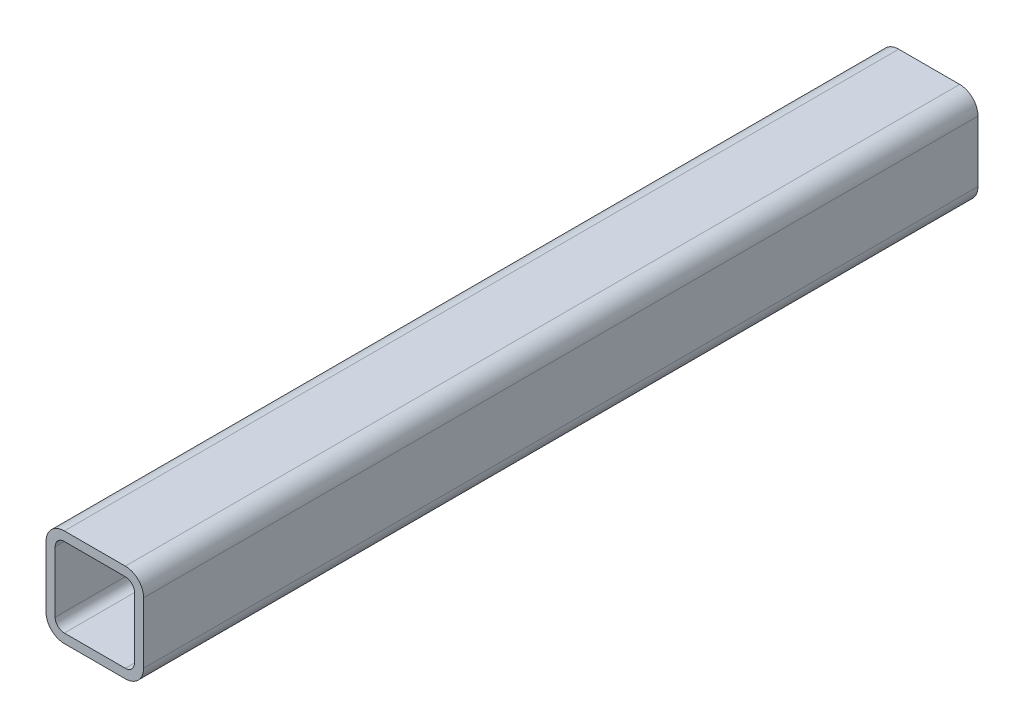
ISO-10303-21;
HEADER;
FILE_DESCRIPTION(('STEP AP214'),'2;1');
FILE_NAME('part.step','',(''),(''),'','','');
FILE_SCHEMA(('AUTOMOTIVE_DESIGN { 1 0 10303 214 1 1 1 1 }'));
ENDSEC;
DATA;
#1=APPLICATION_CONTEXT('core data for automotive mechanical design processes');
#2=APPLICATION_PROTOCOL_DEFINITION('international standard','automotive_design',2000,#1);
#3=PRODUCT_CONTEXT('',#1,'mechanical');
#4=PRODUCT('Part','Part','',(#3));
#5=PRODUCT_RELATED_PRODUCT_CATEGORY('part','',(#4));
#6=PRODUCT_DEFINITION_FORMATION('','',#4);
#7=PRODUCT_DEFINITION_CONTEXT('part definition',#1,'design');
#8=PRODUCT_DEFINITION('design','',#6,#7);
#9=PRODUCT_DEFINITION_SHAPE('','',#8);
#10=(LENGTH_UNIT() NAMED_UNIT(*) SI_UNIT(.MILLI.,.METRE.));
#11=(NAMED_UNIT(*) PLANE_ANGLE_UNIT() SI_UNIT($,.RADIAN.));
#12=(NAMED_UNIT(*) SI_UNIT($,.STERADIAN.) SOLID_ANGLE_UNIT());
#13=UNCERTAINTY_MEASURE_WITH_UNIT(LENGTH_MEASURE(1.E-05),#10,'distance_accuracy_value','');
#14=(GEOMETRIC_REPRESENTATION_CONTEXT(3) GLOBAL_UNCERTAINTY_ASSIGNED_CONTEXT((#13)) GLOBAL_UNIT_ASSIGNED_CONTEXT((#10,
#11,#12)) REPRESENTATION_CONTEXT('',''));
#15=CARTESIAN_POINT('',(0.,0.,0.));
#16=DIRECTION('',(0.,0.,1.));
#17=DIRECTION('',(1.,0.,0.));
#18=AXIS2_PLACEMENT_3D('',#15,#16,#17);
#19=CARTESIAN_POINT('',(41.27,41.27,434.2));
#20=DIRECTION('',(0.,0.,-1.));
#21=DIRECTION('',(-1.,0.,0.));
#22=AXIS2_PLACEMENT_3D('',#19,#20,#21);
#23=PLANE('',#22);
#24=CARTESIAN_POINT('',(41.27,41.27,434.2));
#25=DIRECTION('',(0.,0.,1.));
#26=DIRECTION('',(-1.,0.,0.));
#27=AXIS2_PLACEMENT_3D('',#24,#25,#26);
#28=CIRCLE('',#27,9.53);
#29=CARTESIAN_POINT('',(50.8,41.2699999999999,434.2));
#30=VERTEX_POINT('',#29);
#31=CARTESIAN_POINT('',(41.2699999999999,50.8,434.2));
#32=VERTEX_POINT('',#31);
#33=EDGE_CURVE('E246',#30,#32,#28,.T.);
#34=ORIENTED_EDGE('',*,*,#33,.T.);
#35=DIRECTION('',(-1.,0.,0.));
#36=VECTOR('',#35,1.);
#37=CARTESIAN_POINT('',(9.53000000000007,50.8,434.2));
#38=LINE('',#37,#36);
#39=CARTESIAN_POINT('',(9.53000000000007,50.8,434.2));
#40=VERTEX_POINT('',#39);
#41=EDGE_CURVE('E250',#32,#40,#38,.T.);
#42=ORIENTED_EDGE('',*,*,#41,.T.);
#43=CARTESIAN_POINT('',(9.53,41.27,434.2));
#44=DIRECTION('',(0.,0.,1.));
#45=DIRECTION('',(-1.,0.,0.));
#46=AXIS2_PLACEMENT_3D('',#43,#44,#45);
#47=CIRCLE('',#46,9.53);
#48=CARTESIAN_POINT('',(0.,41.2699999999999,434.2));
#49=VERTEX_POINT('',#48);
#50=EDGE_CURVE('E254',#40,#49,#47,.T.);
#51=ORIENTED_EDGE('',*,*,#50,.T.);
#52=DIRECTION('',(0.,-1.,0.));
#53=VECTOR('',#52,1.);
#54=CARTESIAN_POINT('',(0.,9.53000000000007,434.2));
#55=LINE('',#54,#53);
#56=CARTESIAN_POINT('',(0.,9.53000000000007,434.2));
#57=VERTEX_POINT('',#56);
#58=EDGE_CURVE('E257',#49,#57,#55,.T.);
#59=ORIENTED_EDGE('',*,*,#58,.T.);
#60=CARTESIAN_POINT('',(9.53,9.53,434.2));
#61=DIRECTION('',(0.,0.,1.));
#62=DIRECTION('',(-1.,0.,0.));
#63=AXIS2_PLACEMENT_3D('',#60,#61,#62);
#64=CIRCLE('',#63,9.53);
#65=CARTESIAN_POINT('',(9.53000000000007,0.,434.2));
#66=VERTEX_POINT('',#65);
#67=EDGE_CURVE('E260',#57,#66,#64,.T.);
#68=ORIENTED_EDGE('',*,*,#67,.T.);
#69=DIRECTION('',(1.,0.,0.));
#70=VECTOR('',#69,1.);
#71=CARTESIAN_POINT('',(9.53000000000007,0.,434.2));
#72=LINE('',#71,#70);
#73=CARTESIAN_POINT('',(41.2699999999999,0.,434.2));
#74=VERTEX_POINT('',#73);
#75=EDGE_CURVE('E263',#66,#74,#72,.T.);
#76=ORIENTED_EDGE('',*,*,#75,.T.);
#77=CARTESIAN_POINT('',(41.27,9.53,434.2));
#78=DIRECTION('',(0.,0.,1.));
#79=DIRECTION('',(-1.,0.,0.));
#80=AXIS2_PLACEMENT_3D('',#77,#78,#79);
#81=CIRCLE('',#80,9.53);
#82=CARTESIAN_POINT('',(50.8,9.53000000000007,434.2));
#83=VERTEX_POINT('',#82);
#84=EDGE_CURVE('E266',#74,#83,#81,.T.);
#85=ORIENTED_EDGE('',*,*,#84,.T.);
#86=DIRECTION('',(0.,1.,0.));
#87=VECTOR('',#86,1.);
#88=CARTESIAN_POINT('',(50.8,9.53000000000007,434.2));
#89=LINE('',#88,#87);
#90=EDGE_CURVE('E269',#83,#30,#89,.T.);
#91=ORIENTED_EDGE('',*,*,#90,.T.);
#92=EDGE_LOOP('',(#34,#42,#51,#59,#68,#76,#85,#91));
#93=FACE_BOUND('',#92,.T.);
#94=CARTESIAN_POINT('',(9.52,9.52,434.2));
#95=DIRECTION('',(0.,0.,1.));
#96=DIRECTION('',(1.,0.,0.));
#97=AXIS2_PLACEMENT_3D('',#94,#95,#96);
#98=CIRCLE('',#97,4.76);
#99=CARTESIAN_POINT('',(4.76,9.52000000000003,434.2));
#100=VERTEX_POINT('',#99);
#101=CARTESIAN_POINT('',(9.52000000000004,4.76,434.2));
#102=VERTEX_POINT('',#101);
#103=EDGE_CURVE('E157',#100,#102,#98,.T.);
#104=ORIENTED_EDGE('',*,*,#103,.F.);
#105=DIRECTION('',(0.,-1.,0.));
#106=VECTOR('',#105,1.);
#107=CARTESIAN_POINT('',(4.76,41.28,434.2));
#108=LINE('',#107,#106);
#109=CARTESIAN_POINT('',(4.76,41.28,434.2));
#110=VERTEX_POINT('',#109);
#111=EDGE_CURVE('E198',#110,#100,#108,.T.);
#112=ORIENTED_EDGE('',*,*,#111,.F.);
#113=CARTESIAN_POINT('',(9.52,41.28,434.2));
#114=DIRECTION('',(0.,0.,1.));
#115=DIRECTION('',(-1.,0.,0.));
#116=AXIS2_PLACEMENT_3D('',#113,#114,#115);
#117=CIRCLE('',#116,4.76);
#118=CARTESIAN_POINT('',(9.52000000000003,46.04,434.2));
#119=VERTEX_POINT('',#118);
#120=EDGE_CURVE('E195',#119,#110,#117,.T.);
#121=ORIENTED_EDGE('',*,*,#120,.F.);
#122=DIRECTION('',(-1.,0.,0.));
#123=VECTOR('',#122,1.);
#124=CARTESIAN_POINT('',(9.52000000000003,46.04,434.2));
#125=LINE('',#124,#123);
#126=CARTESIAN_POINT('',(41.28,46.04,434.2));
#127=VERTEX_POINT('',#126);
#128=EDGE_CURVE('E192',#127,#119,#125,.T.);
#129=ORIENTED_EDGE('',*,*,#128,.F.);
#130=CARTESIAN_POINT('',(41.28,41.28,434.2));
#131=DIRECTION('',(0.,0.,1.));
#132=DIRECTION('',(1.,0.,0.));
#133=AXIS2_PLACEMENT_3D('',#130,#131,#132);
#134=CIRCLE('',#133,4.76);
#135=CARTESIAN_POINT('',(46.04,41.28,434.2));
#136=VERTEX_POINT('',#135);
#137=EDGE_CURVE('E189',#136,#127,#134,.T.);
#138=ORIENTED_EDGE('',*,*,#137,.F.);
#139=DIRECTION('',(0.,1.,0.));
#140=VECTOR('',#139,1.);
#141=CARTESIAN_POINT('',(46.04,41.28,434.2));
#142=LINE('',#141,#140);
#143=CARTESIAN_POINT('',(46.04,9.52000000000003,434.2));
#144=VERTEX_POINT('',#143);
#145=EDGE_CURVE('E184',#144,#136,#142,.T.);
#146=ORIENTED_EDGE('',*,*,#145,.F.);
#147=CARTESIAN_POINT('',(41.28,9.52,434.2));
#148=DIRECTION('',(0.,0.,1.));
#149=DIRECTION('',(1.,0.,0.));
#150=AXIS2_PLACEMENT_3D('',#147,#148,#149);
#151=CIRCLE('',#150,4.76);
#152=CARTESIAN_POINT('',(41.28,4.76,434.2));
#153=VERTEX_POINT('',#152);
#154=EDGE_CURVE('E180',#153,#144,#151,.T.);
#155=ORIENTED_EDGE('',*,*,#154,.F.);
#156=DIRECTION('',(1.,0.,0.));
#157=VECTOR('',#156,1.);
#158=CARTESIAN_POINT('',(9.52000000000004,4.76,434.2));
#159=LINE('',#158,#157);
#160=EDGE_CURVE('E166',#102,#153,#159,.T.);
#161=ORIENTED_EDGE('',*,*,#160,.F.);
#162=EDGE_LOOP('',(#104,#112,#121,#129,#138,#146,#155,#161));
#163=FACE_BOUND('',#162,.T.);
#164=ADVANCED_FACE('F43',(#93,#163),#23,.F.);
#165=CARTESIAN_POINT('',(41.27,41.27,0.));
#166=DIRECTION('',(0.,0.,-1.));
#167=DIRECTION('',(-1.,0.,0.));
#168=AXIS2_PLACEMENT_3D('',#165,#166,#167);
#169=PLANE('',#168);
#170=CARTESIAN_POINT('',(41.27,41.27,0.));
#171=DIRECTION('',(0.,0.,1.));
#172=DIRECTION('',(-1.,0.,0.));
#173=AXIS2_PLACEMENT_3D('',#170,#171,#172);
#174=CIRCLE('',#173,9.53);
#175=CARTESIAN_POINT('',(50.8,41.2699999999999,0.));
#176=VERTEX_POINT('',#175);
#177=CARTESIAN_POINT('',(41.2699999999999,50.8,0.));
#178=VERTEX_POINT('',#177);
#179=EDGE_CURVE('E175',#176,#178,#174,.T.);
#180=ORIENTED_EDGE('',*,*,#179,.F.);
#181=DIRECTION('',(0.,1.,0.));
#182=VECTOR('',#181,1.);
#183=CARTESIAN_POINT('',(50.8,9.53000000000007,0.));
#184=LINE('',#183,#182);
#185=CARTESIAN_POINT('',(50.8,9.53000000000007,0.));
#186=VERTEX_POINT('',#185);
#187=EDGE_CURVE('E251',#186,#176,#184,.T.);
#188=ORIENTED_EDGE('',*,*,#187,.F.);
#189=CARTESIAN_POINT('',(41.27,9.53,0.));
#190=DIRECTION('',(0.,0.,1.));
#191=DIRECTION('',(-1.,0.,0.));
#192=AXIS2_PLACEMENT_3D('',#189,#190,#191);
#193=CIRCLE('',#192,9.53);
#194=CARTESIAN_POINT('',(41.2699999999999,0.,0.));
#195=VERTEX_POINT('',#194);
#196=EDGE_CURVE('E291',#195,#186,#193,.T.);
#197=ORIENTED_EDGE('',*,*,#196,.F.);
#198=DIRECTION('',(1.,0.,0.));
#199=VECTOR('',#198,1.);
#200=CARTESIAN_POINT('',(9.53000000000007,0.,0.));
#201=LINE('',#200,#199);
#202=CARTESIAN_POINT('',(9.53000000000007,0.,0.));
#203=VERTEX_POINT('',#202);
#204=EDGE_CURVE('E288',#203,#195,#201,.T.);
#205=ORIENTED_EDGE('',*,*,#204,.F.);
#206=CARTESIAN_POINT('',(9.53,9.53,0.));
#207=DIRECTION('',(0.,0.,1.));
#208=DIRECTION('',(-1.,0.,0.));
#209=AXIS2_PLACEMENT_3D('',#206,#207,#208);
#210=CIRCLE('',#209,9.53);
#211=CARTESIAN_POINT('',(0.,9.53000000000007,0.));
#212=VERTEX_POINT('',#211);
#213=EDGE_CURVE('E285',#212,#203,#210,.T.);
#214=ORIENTED_EDGE('',*,*,#213,.F.);
#215=DIRECTION('',(0.,-1.,0.));
#216=VECTOR('',#215,1.);
#217=CARTESIAN_POINT('',(0.,9.53000000000007,0.));
#218=LINE('',#217,#216);
#219=CARTESIAN_POINT('',(0.,41.2699999999999,0.));
#220=VERTEX_POINT('',#219);
#221=EDGE_CURVE('E282',#220,#212,#218,.T.);
#222=ORIENTED_EDGE('',*,*,#221,.F.);
#223=CARTESIAN_POINT('',(9.53,41.27,0.));
#224=DIRECTION('',(0.,0.,1.));
#225=DIRECTION('',(-1.,0.,0.));
#226=AXIS2_PLACEMENT_3D('',#223,#224,#225);
#227=CIRCLE('',#226,9.53);
#228=CARTESIAN_POINT('',(9.53000000000007,50.8,0.));
#229=VERTEX_POINT('',#228);
#230=EDGE_CURVE('E279',#229,#220,#227,.T.);
#231=ORIENTED_EDGE('',*,*,#230,.F.);
#232=DIRECTION('',(-1.,0.,0.));
#233=VECTOR('',#232,1.);
#234=CARTESIAN_POINT('',(9.53000000000007,50.8,0.));
#235=LINE('',#234,#233);
#236=EDGE_CURVE('E276',#178,#229,#235,.T.);
#237=ORIENTED_EDGE('',*,*,#236,.F.);
#238=EDGE_LOOP('',(#180,#188,#197,#205,#214,#222,#231,#237));
#239=FACE_BOUND('',#238,.T.);
#240=DIRECTION('',(0.,-1.,0.));
#241=VECTOR('',#240,1.);
#242=CARTESIAN_POINT('',(4.76,41.28,0.));
#243=LINE('',#242,#241);
#244=CARTESIAN_POINT('',(4.76,41.28,0.));
#245=VERTEX_POINT('',#244);
#246=CARTESIAN_POINT('',(4.76,9.52000000000004,0.));
#247=VERTEX_POINT('',#246);
#248=EDGE_CURVE('E167',#245,#247,#243,.T.);
#249=ORIENTED_EDGE('',*,*,#248,.T.);
#250=CARTESIAN_POINT('',(9.52,9.52,0.));
#251=DIRECTION('',(0.,0.,1.));
#252=DIRECTION('',(1.,0.,0.));
#253=AXIS2_PLACEMENT_3D('',#250,#251,#252);
#254=CIRCLE('',#253,4.76);
#255=CARTESIAN_POINT('',(9.52000000000004,4.76,0.));
#256=VERTEX_POINT('',#255);
#257=EDGE_CURVE('E67',#247,#256,#254,.T.);
#258=ORIENTED_EDGE('',*,*,#257,.T.);
#259=DIRECTION('',(1.,0.,0.));
#260=VECTOR('',#259,1.);
#261=CARTESIAN_POINT('',(9.52000000000004,4.76,0.));
#262=LINE('',#261,#260);
#263=CARTESIAN_POINT('',(41.28,4.76,0.));
#264=VERTEX_POINT('',#263);
#265=EDGE_CURVE('E173',#256,#264,#262,.T.);
#266=ORIENTED_EDGE('',*,*,#265,.T.);
#267=CARTESIAN_POINT('',(41.28,9.52,0.));
#268=DIRECTION('',(0.,0.,1.));
#269=DIRECTION('',(1.,0.,0.));
#270=AXIS2_PLACEMENT_3D('',#267,#268,#269);
#271=CIRCLE('',#270,4.76);
#272=CARTESIAN_POINT('',(46.04,9.52000000000003,0.));
#273=VERTEX_POINT('',#272);
#274=EDGE_CURVE('E205',#264,#273,#271,.T.);
#275=ORIENTED_EDGE('',*,*,#274,.T.);
#276=DIRECTION('',(0.,1.,0.));
#277=VECTOR('',#276,1.);
#278=CARTESIAN_POINT('',(46.04,41.28,0.));
#279=LINE('',#278,#277);
#280=CARTESIAN_POINT('',(46.04,41.28,0.));
#281=VERTEX_POINT('',#280);
#282=EDGE_CURVE('E209',#273,#281,#279,.T.);
#283=ORIENTED_EDGE('',*,*,#282,.T.);
#284=CARTESIAN_POINT('',(41.28,41.28,0.));
#285=DIRECTION('',(0.,0.,1.));
#286=DIRECTION('',(1.,0.,0.));
#287=AXIS2_PLACEMENT_3D('',#284,#285,#286);
#288=CIRCLE('',#287,4.76);
#289=CARTESIAN_POINT('',(41.28,46.04,0.));
#290=VERTEX_POINT('',#289);
#291=EDGE_CURVE('E213',#281,#290,#288,.T.);
#292=ORIENTED_EDGE('',*,*,#291,.T.);
#293=DIRECTION('',(-1.,0.,0.));
#294=VECTOR('',#293,1.);
#295=CARTESIAN_POINT('',(9.52000000000003,46.04,0.));
#296=LINE('',#295,#294);
#297=CARTESIAN_POINT('',(9.52000000000003,46.04,0.));
#298=VERTEX_POINT('',#297);
#299=EDGE_CURVE('E217',#290,#298,#296,.T.);
#300=ORIENTED_EDGE('',*,*,#299,.T.);
#301=CARTESIAN_POINT('',(9.52,41.28,0.));
#302=DIRECTION('',(0.,0.,1.));
#303=DIRECTION('',(-1.,0.,0.));
#304=AXIS2_PLACEMENT_3D('',#301,#302,#303);
#305=CIRCLE('',#304,4.76);
#306=EDGE_CURVE('E221',#298,#245,#305,.T.);
#307=ORIENTED_EDGE('',*,*,#306,.T.);
#308=EDGE_LOOP('',(#249,#258,#266,#275,#283,#292,#300,#307));
#309=FACE_BOUND('',#308,.T.);
#310=ADVANCED_FACE('F330',(#239,#309),#169,.T.);
#311=CARTESIAN_POINT('',(41.27,41.27,434.2));
#312=DIRECTION('',(0.,0.,-1.));
#313=DIRECTION('',(-1.,0.,0.));
#314=AXIS2_PLACEMENT_3D('',#311,#312,#313);
#315=CYLINDRICAL_SURFACE('',#314,9.53);
#316=ORIENTED_EDGE('',*,*,#179,.T.);
#317=DIRECTION('',(0.,0.,-1.));
#318=VECTOR('',#317,1.);
#319=CARTESIAN_POINT('',(41.2699999999999,50.8,434.2));
#320=LINE('',#319,#318);
#321=EDGE_CURVE('E11',#32,#178,#320,.T.);
#322=ORIENTED_EDGE('',*,*,#321,.F.);
#323=ORIENTED_EDGE('',*,*,#33,.F.);
#324=DIRECTION('',(0.,0.,-1.));
#325=VECTOR('',#324,1.);
#326=CARTESIAN_POINT('',(50.8,41.2699999999999,434.2));
#327=LINE('',#326,#325);
#328=EDGE_CURVE('E272',#30,#176,#327,.T.);
#329=ORIENTED_EDGE('',*,*,#328,.T.);
#330=EDGE_LOOP('',(#316,#322,#323,#329));
#331=FACE_BOUND('',#330,.T.);
#332=ADVANCED_FACE('F45',(#331),#315,.T.);
#333=CARTESIAN_POINT('',(9.53000000000007,50.8,434.2));
#334=DIRECTION('',(0.,-1.,0.));
#335=DIRECTION('',(0.,0.,-1.));
#336=AXIS2_PLACEMENT_3D('',#333,#334,#335);
#337=PLANE('',#336);
#338=ORIENTED_EDGE('',*,*,#236,.T.);
#339=DIRECTION('',(0.,0.,-1.));
#340=VECTOR('',#339,1.);
#341=CARTESIAN_POINT('',(9.53000000000007,50.8,434.2));
#342=LINE('',#341,#340);
#343=EDGE_CURVE('E52',#40,#229,#342,.T.);
#344=ORIENTED_EDGE('',*,*,#343,.F.);
#345=ORIENTED_EDGE('',*,*,#41,.F.);
#346=ORIENTED_EDGE('',*,*,#321,.T.);
#347=EDGE_LOOP('',(#338,#344,#345,#346));
#348=FACE_BOUND('',#347,.T.);
#349=ADVANCED_FACE('F347',(#348),#337,.F.);
#350=CARTESIAN_POINT('',(9.53,41.27,434.2));
#351=DIRECTION('',(0.,0.,-1.));
#352=DIRECTION('',(-1.,0.,0.));
#353=AXIS2_PLACEMENT_3D('',#350,#351,#352);
#354=CYLINDRICAL_SURFACE('',#353,9.53);
#355=ORIENTED_EDGE('',*,*,#230,.T.);
#356=DIRECTION('',(0.,0.,-1.));
#357=VECTOR('',#356,1.);
#358=CARTESIAN_POINT('',(0.,41.2699999999999,434.2));
#359=LINE('',#358,#357);
#360=EDGE_CURVE('E315',#49,#220,#359,.T.);
#361=ORIENTED_EDGE('',*,*,#360,.F.);
#362=ORIENTED_EDGE('',*,*,#50,.F.);
#363=ORIENTED_EDGE('',*,*,#343,.T.);
#364=EDGE_LOOP('',(#355,#361,#362,#363));
#365=FACE_BOUND('',#364,.T.);
#366=ADVANCED_FACE('F324',(#365),#354,.T.);
#367=CARTESIAN_POINT('',(0.,9.53000000000007,434.2));
#368=DIRECTION('',(1.,0.,0.));
#369=DIRECTION('',(0.,0.,-1.));
#370=AXIS2_PLACEMENT_3D('',#367,#368,#369);
#371=PLANE('',#370);
#372=ORIENTED_EDGE('',*,*,#221,.T.);
#373=DIRECTION('',(0.,0.,-1.));
#374=VECTOR('',#373,1.);
#375=CARTESIAN_POINT('',(0.,9.53000000000007,434.2));
#376=LINE('',#375,#374);
#377=EDGE_CURVE('E311',#57,#212,#376,.T.);
#378=ORIENTED_EDGE('',*,*,#377,.F.);
#379=ORIENTED_EDGE('',*,*,#58,.F.);
#380=ORIENTED_EDGE('',*,*,#360,.T.);
#381=EDGE_LOOP('',(#372,#378,#379,#380));
#382=FACE_BOUND('',#381,.T.);
#383=ADVANCED_FACE('F336',(#382),#371,.F.);
#384=CARTESIAN_POINT('',(9.53,9.53,434.2));
#385=DIRECTION('',(0.,0.,-1.));
#386=DIRECTION('',(-1.,0.,0.));
#387=AXIS2_PLACEMENT_3D('',#384,#385,#386);
#388=CYLINDRICAL_SURFACE('',#387,9.53);
#389=ORIENTED_EDGE('',*,*,#213,.T.);
#390=DIRECTION('',(0.,0.,-1.));
#391=VECTOR('',#390,1.);
#392=CARTESIAN_POINT('',(9.53000000000007,0.,434.2));
#393=LINE('',#392,#391);
#394=EDGE_CURVE('E307',#66,#203,#393,.T.);
#395=ORIENTED_EDGE('',*,*,#394,.F.);
#396=ORIENTED_EDGE('',*,*,#67,.F.);
#397=ORIENTED_EDGE('',*,*,#377,.T.);
#398=EDGE_LOOP('',(#389,#395,#396,#397));
#399=FACE_BOUND('',#398,.T.);
#400=ADVANCED_FACE('F340',(#399),#388,.T.);
#401=CARTESIAN_POINT('',(9.53000000000007,0.,434.2));
#402=DIRECTION('',(0.,1.,0.));
#403=DIRECTION('',(0.,0.,1.));
#404=AXIS2_PLACEMENT_3D('',#401,#402,#403);
#405=PLANE('',#404);
#406=ORIENTED_EDGE('',*,*,#204,.T.);
#407=DIRECTION('',(0.,0.,-1.));
#408=VECTOR('',#407,1.);
#409=CARTESIAN_POINT('',(41.2699999999999,0.,434.2));
#410=LINE('',#409,#408);
#411=EDGE_CURVE('E303',#74,#195,#410,.T.);
#412=ORIENTED_EDGE('',*,*,#411,.F.);
#413=ORIENTED_EDGE('',*,*,#75,.F.);
#414=ORIENTED_EDGE('',*,*,#394,.T.);
#415=EDGE_LOOP('',(#406,#412,#413,#414));
#416=FACE_BOUND('',#415,.T.);
#417=ADVANCED_FACE('F360',(#416),#405,.F.);
#418=CARTESIAN_POINT('',(41.27,9.53,434.2));
#419=DIRECTION('',(0.,0.,-1.));
#420=DIRECTION('',(-1.,0.,0.));
#421=AXIS2_PLACEMENT_3D('',#418,#419,#420);
#422=CYLINDRICAL_SURFACE('',#421,9.53);
#423=ORIENTED_EDGE('',*,*,#196,.T.);
#424=DIRECTION('',(0.,0.,-1.));
#425=VECTOR('',#424,1.);
#426=CARTESIAN_POINT('',(50.8,9.53000000000007,434.2));
#427=LINE('',#426,#425);
#428=EDGE_CURVE('E299',#83,#186,#427,.T.);
#429=ORIENTED_EDGE('',*,*,#428,.F.);
#430=ORIENTED_EDGE('',*,*,#84,.F.);
#431=ORIENTED_EDGE('',*,*,#411,.T.);
#432=EDGE_LOOP('',(#423,#429,#430,#431));
#433=FACE_BOUND('',#432,.T.);
#434=ADVANCED_FACE('F358',(#433),#422,.T.);
#435=CARTESIAN_POINT('',(50.8,9.53000000000007,434.2));
#436=DIRECTION('',(-1.,0.,0.));
#437=DIRECTION('',(0.,0.,1.));
#438=AXIS2_PLACEMENT_3D('',#435,#436,#437);
#439=PLANE('',#438);
#440=ORIENTED_EDGE('',*,*,#187,.T.);
#441=ORIENTED_EDGE('',*,*,#328,.F.);
#442=ORIENTED_EDGE('',*,*,#90,.F.);
#443=ORIENTED_EDGE('',*,*,#428,.T.);
#444=EDGE_LOOP('',(#440,#441,#442,#443));
#445=FACE_BOUND('',#444,.T.);
#446=ADVANCED_FACE('F353',(#445),#439,.F.);
#447=CARTESIAN_POINT('',(9.52,9.52,434.2));
#448=DIRECTION('',(0.,0.,-1.));
#449=DIRECTION('',(-1.,0.,0.));
#450=AXIS2_PLACEMENT_3D('',#447,#448,#449);
#451=CYLINDRICAL_SURFACE('',#450,4.76);
#452=ORIENTED_EDGE('',*,*,#257,.F.);
#453=DIRECTION('',(0.,0.,-1.));
#454=VECTOR('',#453,1.);
#455=CARTESIAN_POINT('',(4.76,9.52000000000003,434.2));
#456=LINE('',#455,#454);
#457=EDGE_CURVE('E161',#100,#247,#456,.T.);
#458=ORIENTED_EDGE('',*,*,#457,.F.);
#459=ORIENTED_EDGE('',*,*,#103,.T.);
#460=DIRECTION('',(0.,0.,-1.));
#461=VECTOR('',#460,1.);
#462=CARTESIAN_POINT('',(9.52000000000004,4.76,434.2));
#463=LINE('',#462,#461);
#464=EDGE_CURVE('E160',#102,#256,#463,.T.);
#465=ORIENTED_EDGE('',*,*,#464,.T.);
#466=EDGE_LOOP('',(#452,#458,#459,#465));
#467=FACE_BOUND('',#466,.T.);
#468=ADVANCED_FACE('F159',(#467),#451,.F.);
#469=CARTESIAN_POINT('',(9.52000000000004,4.76,434.2));
#470=DIRECTION('',(0.,1.,0.));
#471=DIRECTION('',(-1.,0.,0.));
#472=AXIS2_PLACEMENT_3D('',#469,#470,#471);
#473=PLANE('',#472);
#474=ORIENTED_EDGE('',*,*,#265,.F.);
#475=ORIENTED_EDGE('',*,*,#464,.F.);
#476=ORIENTED_EDGE('',*,*,#160,.T.);
#477=DIRECTION('',(0.,0.,-1.));
#478=VECTOR('',#477,1.);
#479=CARTESIAN_POINT('',(41.28,4.76,434.2));
#480=LINE('',#479,#478);
#481=EDGE_CURVE('E176',#153,#264,#480,.T.);
#482=ORIENTED_EDGE('',*,*,#481,.T.);
#483=EDGE_LOOP('',(#474,#475,#476,#482));
#484=FACE_BOUND('',#483,.T.);
#485=ADVANCED_FACE('F170',(#484),#473,.T.);
#486=CARTESIAN_POINT('',(41.28,9.52,434.2));
#487=DIRECTION('',(0.,0.,-1.));
#488=DIRECTION('',(-1.,0.,0.));
#489=AXIS2_PLACEMENT_3D('',#486,#487,#488);
#490=CYLINDRICAL_SURFACE('',#489,4.76);
#491=ORIENTED_EDGE('',*,*,#274,.F.);
#492=ORIENTED_EDGE('',*,*,#481,.F.);
#493=ORIENTED_EDGE('',*,*,#154,.T.);
#494=DIRECTION('',(0.,0.,-1.));
#495=VECTOR('',#494,1.);
#496=CARTESIAN_POINT('',(46.04,9.52000000000003,434.2));
#497=LINE('',#496,#495);
#498=EDGE_CURVE('E241',#144,#273,#497,.T.);
#499=ORIENTED_EDGE('',*,*,#498,.T.);
#500=EDGE_LOOP('',(#491,#492,#493,#499));
#501=FACE_BOUND('',#500,.T.);
#502=ADVANCED_FACE('F385',(#501),#490,.F.);
#503=CARTESIAN_POINT('',(46.04,41.28,434.2));
#504=DIRECTION('',(-1.,0.,0.));
#505=DIRECTION('',(0.,-1.,0.));
#506=AXIS2_PLACEMENT_3D('',#503,#504,#505);
#507=PLANE('',#506);
#508=ORIENTED_EDGE('',*,*,#282,.F.);
#509=ORIENTED_EDGE('',*,*,#498,.F.);
#510=ORIENTED_EDGE('',*,*,#145,.T.);
#511=DIRECTION('',(0.,0.,-1.));
#512=VECTOR('',#511,1.);
#513=CARTESIAN_POINT('',(46.04,41.28,434.2));
#514=LINE('',#513,#512);
#515=EDGE_CURVE('E238',#136,#281,#514,.T.);
#516=ORIENTED_EDGE('',*,*,#515,.T.);
#517=EDGE_LOOP('',(#508,#509,#510,#516));
#518=FACE_BOUND('',#517,.T.);
#519=ADVANCED_FACE('F389',(#518),#507,.T.);
#520=CARTESIAN_POINT('',(41.28,41.28,434.2));
#521=DIRECTION('',(0.,0.,-1.));
#522=DIRECTION('',(-1.,0.,0.));
#523=AXIS2_PLACEMENT_3D('',#520,#521,#522);
#524=CYLINDRICAL_SURFACE('',#523,4.76);
#525=ORIENTED_EDGE('',*,*,#291,.F.);
#526=ORIENTED_EDGE('',*,*,#515,.F.);
#527=ORIENTED_EDGE('',*,*,#137,.T.);
#528=DIRECTION('',(0.,0.,-1.));
#529=VECTOR('',#528,1.);
#530=CARTESIAN_POINT('',(41.28,46.04,434.2));
#531=LINE('',#530,#529);
#532=EDGE_CURVE('E235',#127,#290,#531,.T.);
#533=ORIENTED_EDGE('',*,*,#532,.T.);
#534=EDGE_LOOP('',(#525,#526,#527,#533));
#535=FACE_BOUND('',#534,.T.);
#536=ADVANCED_FACE('F395',(#535),#524,.F.);
#537=CARTESIAN_POINT('',(9.52000000000003,46.04,434.2));
#538=DIRECTION('',(0.,-1.,0.));
#539=DIRECTION('',(0.,0.,-1.));
#540=AXIS2_PLACEMENT_3D('',#537,#538,#539);
#541=PLANE('',#540);
#542=ORIENTED_EDGE('',*,*,#299,.F.);
#543=ORIENTED_EDGE('',*,*,#532,.F.);
#544=ORIENTED_EDGE('',*,*,#128,.T.);
#545=DIRECTION('',(0.,0.,-1.));
#546=VECTOR('',#545,1.);
#547=CARTESIAN_POINT('',(9.52000000000003,46.04,434.2));
#548=LINE('',#547,#546);
#549=EDGE_CURVE('E232',#119,#298,#548,.T.);
#550=ORIENTED_EDGE('',*,*,#549,.T.);
#551=EDGE_LOOP('',(#542,#543,#544,#550));
#552=FACE_BOUND('',#551,.T.);
#553=ADVANCED_FACE('F399',(#552),#541,.T.);
#554=CARTESIAN_POINT('',(9.52,41.28,434.2));
#555=DIRECTION('',(0.,0.,-1.));
#556=DIRECTION('',(-1.,0.,0.));
#557=AXIS2_PLACEMENT_3D('',#554,#555,#556);
#558=CYLINDRICAL_SURFACE('',#557,4.76);
#559=ORIENTED_EDGE('',*,*,#306,.F.);
#560=ORIENTED_EDGE('',*,*,#549,.F.);
#561=ORIENTED_EDGE('',*,*,#120,.T.);
#562=DIRECTION('',(0.,0.,-1.));
#563=VECTOR('',#562,1.);
#564=CARTESIAN_POINT('',(4.76,41.28,434.2));
#565=LINE('',#564,#563);
#566=EDGE_CURVE('E59',#110,#245,#565,.T.);
#567=ORIENTED_EDGE('',*,*,#566,.T.);
#568=EDGE_LOOP('',(#559,#560,#561,#567));
#569=FACE_BOUND('',#568,.T.);
#570=ADVANCED_FACE('F403',(#569),#558,.F.);
#571=CARTESIAN_POINT('',(4.76,41.28,434.2));
#572=DIRECTION('',(1.,0.,0.));
#573=DIRECTION('',(0.,1.,0.));
#574=AXIS2_PLACEMENT_3D('',#571,#572,#573);
#575=PLANE('',#574);
#576=ORIENTED_EDGE('',*,*,#248,.F.);
#577=ORIENTED_EDGE('',*,*,#566,.F.);
#578=ORIENTED_EDGE('',*,*,#111,.T.);
#579=ORIENTED_EDGE('',*,*,#457,.T.);
#580=EDGE_LOOP('',(#576,#577,#578,#579));
#581=FACE_BOUND('',#580,.T.);
#582=ADVANCED_FACE('F407',(#581),#575,.T.);
#583=CLOSED_SHELL('',(#164,#310,#332,#349,#366,#383,#400,#417,#434,#446,#468,#485,#502,#519,
#536,#553,#570,#582));
#584=MANIFOLD_SOLID_BREP('B2',#583);
#585=ADVANCED_BREP_SHAPE_REPRESENTATION('',(#18,#584),#14);
#586=SHAPE_DEFINITION_REPRESENTATION(#9,#585);
ENDSEC;
END-ISO-10303-21;
